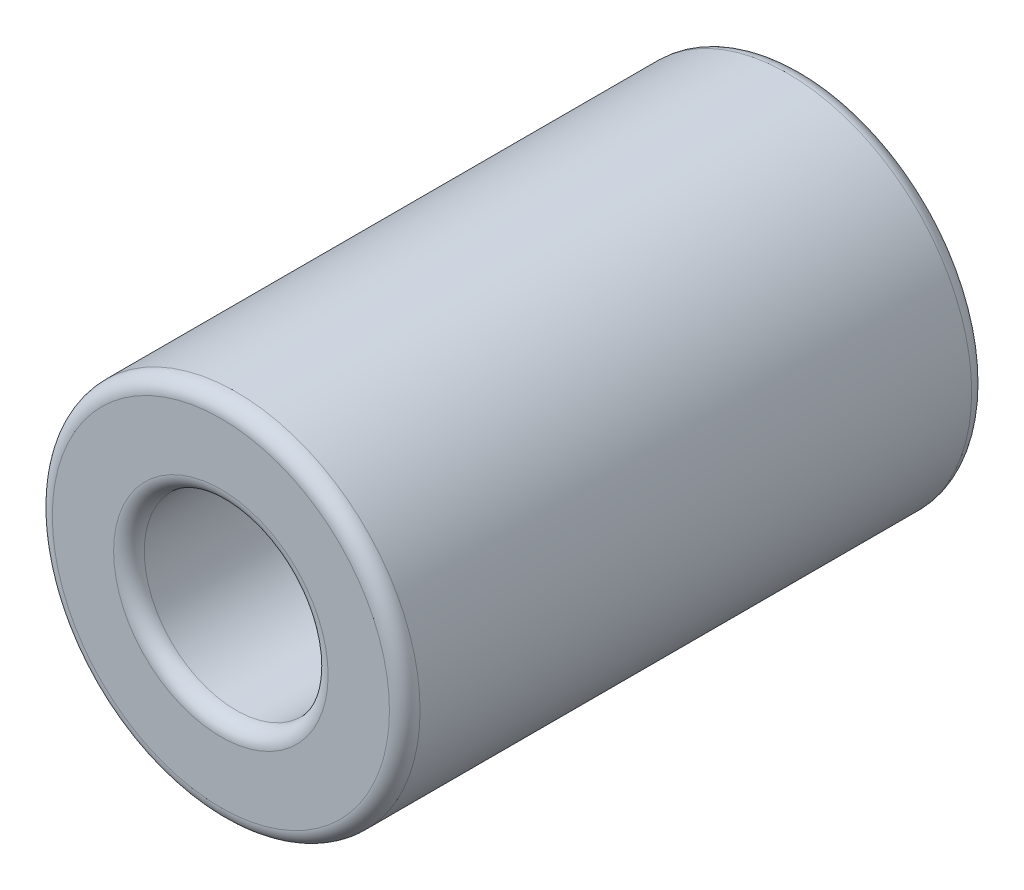
ISO-10303-21;
HEADER;
FILE_DESCRIPTION(('STEP AP214'),'2;1');
FILE_NAME('part.step','',(''),(''),'','','');
FILE_SCHEMA(('AUTOMOTIVE_DESIGN { 1 0 10303 214 1 1 1 1 }'));
ENDSEC;
DATA;
#1=APPLICATION_CONTEXT('core data for automotive mechanical design processes');
#2=APPLICATION_PROTOCOL_DEFINITION('international standard','automotive_design',2000,#1);
#3=PRODUCT_CONTEXT('',#1,'mechanical');
#4=PRODUCT('Part','Part','',(#3));
#5=PRODUCT_RELATED_PRODUCT_CATEGORY('part','',(#4));
#6=PRODUCT_DEFINITION_FORMATION('','',#4);
#7=PRODUCT_DEFINITION_CONTEXT('part definition',#1,'design');
#8=PRODUCT_DEFINITION('design','',#6,#7);
#9=PRODUCT_DEFINITION_SHAPE('','',#8);
#10=(LENGTH_UNIT() NAMED_UNIT(*) SI_UNIT(.MILLI.,.METRE.));
#11=(NAMED_UNIT(*) PLANE_ANGLE_UNIT() SI_UNIT($,.RADIAN.));
#12=(NAMED_UNIT(*) SI_UNIT($,.STERADIAN.) SOLID_ANGLE_UNIT());
#13=UNCERTAINTY_MEASURE_WITH_UNIT(LENGTH_MEASURE(1.E-05),#10,'distance_accuracy_value','');
#14=(GEOMETRIC_REPRESENTATION_CONTEXT(3) GLOBAL_UNCERTAINTY_ASSIGNED_CONTEXT((#13)) GLOBAL_UNIT_ASSIGNED_CONTEXT((#10,
#11,#12)) REPRESENTATION_CONTEXT('',''));
#15=CARTESIAN_POINT('',(0.,0.,0.));
#16=DIRECTION('',(0.,0.,1.));
#17=DIRECTION('',(1.,0.,0.));
#18=AXIS2_PLACEMENT_3D('',#15,#16,#17);
#19=CARTESIAN_POINT('',(0.,0.,19.));
#20=DIRECTION('',(0.,0.,1.));
#21=DIRECTION('',(1.,0.,0.));
#22=AXIS2_PLACEMENT_3D('',#19,#20,#21);
#23=PLANE('',#22);
#24=CARTESIAN_POINT('',(0.,0.,19.));
#25=DIRECTION('',(0.,0.,1.));
#26=DIRECTION('',(1.,0.,0.));
#27=AXIS2_PLACEMENT_3D('',#24,#25,#26);
#28=CIRCLE('',#27,3.5);
#29=CARTESIAN_POINT('',(3.5,0.,19.));
#30=VERTEX_POINT('',#29);
#31=EDGE_CURVE('E62',#30,#30,#28,.F.);
#32=ORIENTED_EDGE('',*,*,#31,.T.);
#33=EDGE_LOOP('',(#32));
#34=FACE_BOUND('',#33,.T.);
#35=CARTESIAN_POINT('',(0.,0.,19.));
#36=DIRECTION('',(0.,0.,1.));
#37=DIRECTION('',(1.,0.,0.));
#38=AXIS2_PLACEMENT_3D('',#35,#36,#37);
#39=CIRCLE('',#38,5.5);
#40=CARTESIAN_POINT('',(5.5,0.,19.));
#41=VERTEX_POINT('',#40);
#42=EDGE_CURVE('E67',#41,#41,#39,.T.);
#43=ORIENTED_EDGE('',*,*,#42,.T.);
#44=EDGE_LOOP('',(#43));
#45=FACE_BOUND('',#44,.T.);
#46=ADVANCED_FACE('F49',(#34,#45),#23,.T.);
#47=CARTESIAN_POINT('',(0.,0.,0.));
#48=DIRECTION('',(0.,0.,1.));
#49=DIRECTION('',(1.,0.,0.));
#50=AXIS2_PLACEMENT_3D('',#47,#48,#49);
#51=PLANE('',#50);
#52=CARTESIAN_POINT('',(0.,0.,0.));
#53=DIRECTION('',(0.,0.,1.));
#54=DIRECTION('',(1.,0.,0.));
#55=AXIS2_PLACEMENT_3D('',#52,#53,#54);
#56=CIRCLE('',#55,3.5);
#57=CARTESIAN_POINT('',(3.5,0.,0.));
#58=VERTEX_POINT('',#57);
#59=EDGE_CURVE('E81',#58,#58,#56,.T.);
#60=ORIENTED_EDGE('',*,*,#59,.T.);
#61=EDGE_LOOP('',(#60));
#62=FACE_BOUND('',#61,.T.);
#63=CARTESIAN_POINT('',(0.,0.,0.));
#64=DIRECTION('',(0.,0.,1.));
#65=DIRECTION('',(1.,0.,0.));
#66=AXIS2_PLACEMENT_3D('',#63,#64,#65);
#67=CIRCLE('',#66,5.5);
#68=CARTESIAN_POINT('',(5.5,0.,0.));
#69=VERTEX_POINT('',#68);
#70=EDGE_CURVE('E85',#69,#69,#67,.F.);
#71=ORIENTED_EDGE('',*,*,#70,.T.);
#72=EDGE_LOOP('',(#71));
#73=FACE_BOUND('',#72,.T.);
#74=ADVANCED_FACE('F90',(#62,#73),#51,.F.);
#75=CARTESIAN_POINT('',(0.,0.,19.));
#76=DIRECTION('',(0.,0.,-1.));
#77=DIRECTION('',(-1.,0.,0.));
#78=AXIS2_PLACEMENT_3D('',#75,#76,#77);
#79=CYLINDRICAL_SURFACE('',#78,6.);
#80=CARTESIAN_POINT('',(0.,0.,18.5));
#81=DIRECTION('',(0.,0.,1.));
#82=DIRECTION('',(1.,0.,0.));
#83=AXIS2_PLACEMENT_3D('',#80,#81,#82);
#84=CIRCLE('',#83,6.);
#85=CARTESIAN_POINT('',(6.,0.,18.5));
#86=VERTEX_POINT('',#85);
#87=EDGE_CURVE('E10',#86,#86,#84,.F.);
#88=ORIENTED_EDGE('',*,*,#87,.T.);
#89=EDGE_LOOP('',(#88));
#90=FACE_BOUND('',#89,.T.);
#91=CARTESIAN_POINT('',(0.,0.,0.5));
#92=DIRECTION('',(0.,0.,1.));
#93=DIRECTION('',(1.,0.,0.));
#94=AXIS2_PLACEMENT_3D('',#91,#92,#93);
#95=CIRCLE('',#94,6.);
#96=CARTESIAN_POINT('',(6.,0.,0.5));
#97=VERTEX_POINT('',#96);
#98=EDGE_CURVE('E57',#97,#97,#95,.T.);
#99=ORIENTED_EDGE('',*,*,#98,.T.);
#100=EDGE_LOOP('',(#99));
#101=FACE_BOUND('',#100,.T.);
#102=ADVANCED_FACE('F106',(#90,#101),#79,.T.);
#103=CARTESIAN_POINT('',(0.,0.,19.));
#104=DIRECTION('',(0.,0.,-1.));
#105=DIRECTION('',(-1.,0.,0.));
#106=AXIS2_PLACEMENT_3D('',#103,#104,#105);
#107=CYLINDRICAL_SURFACE('',#106,3.);
#108=CARTESIAN_POINT('',(0.,0.,0.5));
#109=DIRECTION('',(0.,0.,1.));
#110=DIRECTION('',(1.,0.,0.));
#111=AXIS2_PLACEMENT_3D('',#108,#109,#110);
#112=CIRCLE('',#111,3.);
#113=CARTESIAN_POINT('',(3.,0.,0.5));
#114=VERTEX_POINT('',#113);
#115=EDGE_CURVE('E73',#114,#114,#112,.F.);
#116=ORIENTED_EDGE('',*,*,#115,.T.);
#117=EDGE_LOOP('',(#116));
#118=FACE_BOUND('',#117,.T.);
#119=CARTESIAN_POINT('',(0.,0.,18.5));
#120=DIRECTION('',(0.,0.,1.));
#121=DIRECTION('',(1.,0.,0.));
#122=AXIS2_PLACEMENT_3D('',#119,#120,#121);
#123=CIRCLE('',#122,3.);
#124=CARTESIAN_POINT('',(3.,0.,18.5));
#125=VERTEX_POINT('',#124);
#126=EDGE_CURVE('E77',#125,#125,#123,.T.);
#127=ORIENTED_EDGE('',*,*,#126,.T.);
#128=EDGE_LOOP('',(#127));
#129=FACE_BOUND('',#128,.T.);
#130=ADVANCED_FACE('F111',(#118,#129),#107,.F.);
#131=CARTESIAN_POINT('',(0.,0.,0.5));
#132=DIRECTION('',(0.,0.,1.));
#133=DIRECTION('',(1.,0.,0.));
#134=AXIS2_PLACEMENT_3D('',#131,#132,#133);
#135=TOROIDAL_SURFACE('',#134,3.5,0.5);
#136=ORIENTED_EDGE('',*,*,#115,.F.);
#137=EDGE_LOOP('',(#136));
#138=FACE_BOUND('',#137,.T.);
#139=ORIENTED_EDGE('',*,*,#59,.F.);
#140=EDGE_LOOP('',(#139));
#141=FACE_BOUND('',#140,.T.);
#142=ADVANCED_FACE('F115',(#138,#141),#135,.T.);
#143=CARTESIAN_POINT('',(0.,0.,18.5));
#144=DIRECTION('',(0.,0.,1.));
#145=DIRECTION('',(1.,0.,0.));
#146=AXIS2_PLACEMENT_3D('',#143,#144,#145);
#147=TOROIDAL_SURFACE('',#146,3.5,0.5);
#148=ORIENTED_EDGE('',*,*,#31,.F.);
#149=EDGE_LOOP('',(#148));
#150=FACE_BOUND('',#149,.T.);
#151=ORIENTED_EDGE('',*,*,#126,.F.);
#152=EDGE_LOOP('',(#151));
#153=FACE_BOUND('',#152,.T.);
#154=ADVANCED_FACE('F98',(#150,#153),#147,.T.);
#155=CARTESIAN_POINT('',(0.,0.,18.5));
#156=DIRECTION('',(0.,0.,1.));
#157=DIRECTION('',(1.,0.,0.));
#158=AXIS2_PLACEMENT_3D('',#155,#156,#157);
#159=TOROIDAL_SURFACE('',#158,5.5,0.5);
#160=ORIENTED_EDGE('',*,*,#87,.F.);
#161=EDGE_LOOP('',(#160));
#162=FACE_BOUND('',#161,.T.);
#163=ORIENTED_EDGE('',*,*,#42,.F.);
#164=EDGE_LOOP('',(#163));
#165=FACE_BOUND('',#164,.T.);
#166=ADVANCED_FACE('F94',(#162,#165),#159,.T.);
#167=CARTESIAN_POINT('',(0.,0.,0.5));
#168=DIRECTION('',(0.,0.,1.));
#169=DIRECTION('',(1.,0.,0.));
#170=AXIS2_PLACEMENT_3D('',#167,#168,#169);
#171=TOROIDAL_SURFACE('',#170,5.5,0.5);
#172=ORIENTED_EDGE('',*,*,#70,.F.);
#173=EDGE_LOOP('',(#172));
#174=FACE_BOUND('',#173,.T.);
#175=ORIENTED_EDGE('',*,*,#98,.F.);
#176=EDGE_LOOP('',(#175));
#177=FACE_BOUND('',#176,.T.);
#178=ADVANCED_FACE('F51',(#174,#177),#171,.T.);
#179=CLOSED_SHELL('',(#46,#74,#102,#130,#142,#154,#166,#178));
#180=MANIFOLD_SOLID_BREP('B2',#179);
#181=ADVANCED_BREP_SHAPE_REPRESENTATION('',(#18,#180),#14);
#182=SHAPE_DEFINITION_REPRESENTATION(#9,#181);
ENDSEC;
END-ISO-10303-21;
